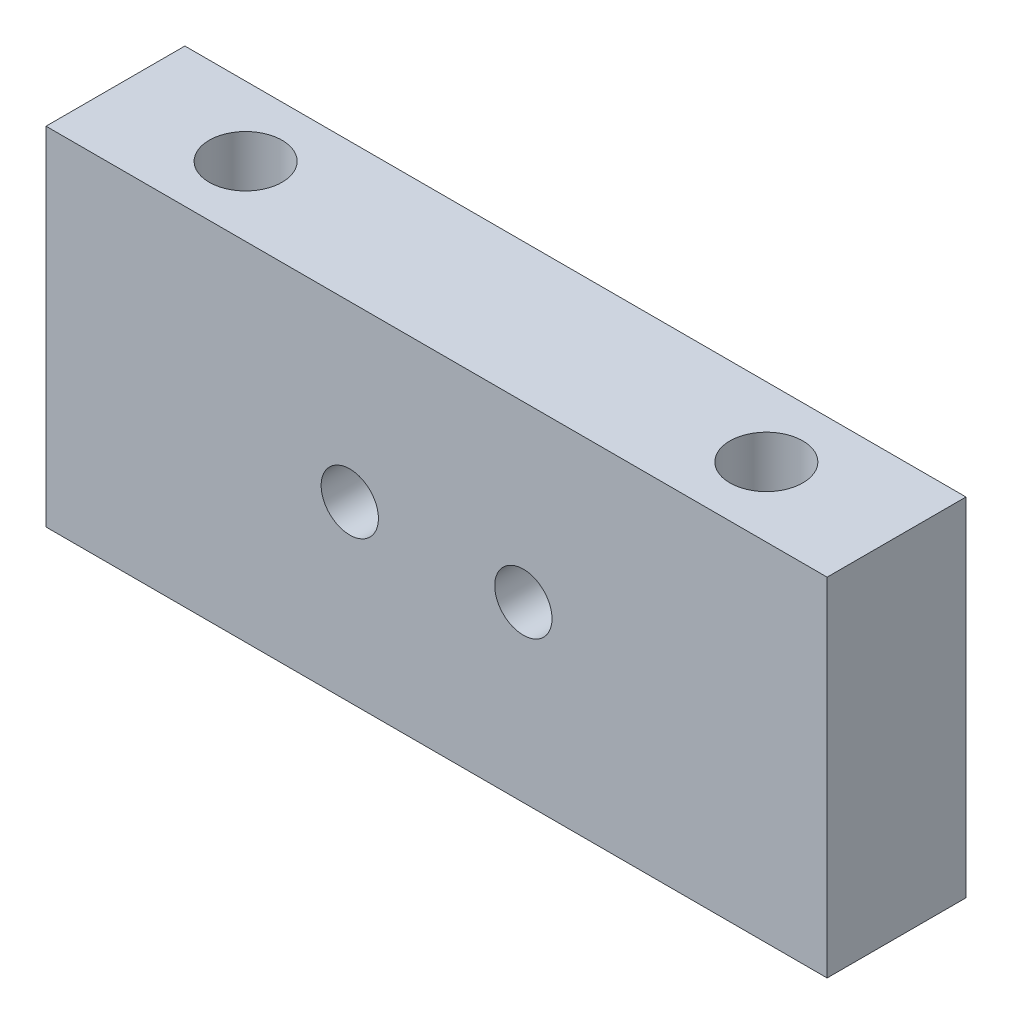
ISO-10303-21;
HEADER;
FILE_DESCRIPTION(('STEP AP214'),'2;1');
FILE_NAME('part.step','',(''),(''),'','','');
FILE_SCHEMA(('AUTOMOTIVE_DESIGN { 1 0 10303 214 1 1 1 1 }'));
ENDSEC;
DATA;
#1=APPLICATION_CONTEXT('core data for automotive mechanical design processes');
#2=APPLICATION_PROTOCOL_DEFINITION('international standard','automotive_design',2000,#1);
#3=PRODUCT_CONTEXT('',#1,'mechanical');
#4=PRODUCT('Part','Part','',(#3));
#5=PRODUCT_RELATED_PRODUCT_CATEGORY('part','',(#4));
#6=PRODUCT_DEFINITION_FORMATION('','',#4);
#7=PRODUCT_DEFINITION_CONTEXT('part definition',#1,'design');
#8=PRODUCT_DEFINITION('design','',#6,#7);
#9=PRODUCT_DEFINITION_SHAPE('','',#8);
#10=(LENGTH_UNIT() NAMED_UNIT(*) SI_UNIT(.MILLI.,.METRE.));
#11=(NAMED_UNIT(*) PLANE_ANGLE_UNIT() SI_UNIT($,.RADIAN.));
#12=(NAMED_UNIT(*) SI_UNIT($,.STERADIAN.) SOLID_ANGLE_UNIT());
#13=UNCERTAINTY_MEASURE_WITH_UNIT(LENGTH_MEASURE(1.E-05),#10,'distance_accuracy_value','');
#14=(GEOMETRIC_REPRESENTATION_CONTEXT(3) GLOBAL_UNCERTAINTY_ASSIGNED_CONTEXT((#13)) GLOBAL_UNIT_ASSIGNED_CONTEXT((#10,
#11,#12)) REPRESENTATION_CONTEXT('',''));
#15=CARTESIAN_POINT('',(0.,0.,0.));
#16=DIRECTION('',(0.,0.,1.));
#17=DIRECTION('',(1.,0.,0.));
#18=AXIS2_PLACEMENT_3D('',#15,#16,#17);
#19=CARTESIAN_POINT('',(0.,0.,8.));
#20=DIRECTION('',(1.,0.,0.));
#21=DIRECTION('',(0.,0.,-1.));
#22=AXIS2_PLACEMENT_3D('',#19,#20,#21);
#23=PLANE('',#22);
#24=DIRECTION('',(0.,-1.,0.));
#25=VECTOR('',#24,1.);
#26=CARTESIAN_POINT('',(0.,0.,0.));
#27=LINE('',#26,#25);
#28=CARTESIAN_POINT('',(0.,20.,0.));
#29=VERTEX_POINT('',#28);
#30=CARTESIAN_POINT('',(0.,0.,0.));
#31=VERTEX_POINT('',#30);
#32=EDGE_CURVE('E122',#29,#31,#27,.T.);
#33=ORIENTED_EDGE('',*,*,#32,.T.);
#34=DIRECTION('',(0.,0.,-1.));
#35=VECTOR('',#34,1.);
#36=CARTESIAN_POINT('',(0.,0.,8.));
#37=LINE('',#36,#35);
#38=CARTESIAN_POINT('',(0.,0.,8.));
#39=VERTEX_POINT('',#38);
#40=EDGE_CURVE('E11',#39,#31,#37,.T.);
#41=ORIENTED_EDGE('',*,*,#40,.F.);
#42=DIRECTION('',(0.,-1.,0.));
#43=VECTOR('',#42,1.);
#44=CARTESIAN_POINT('',(0.,0.,8.));
#45=LINE('',#44,#43);
#46=CARTESIAN_POINT('',(0.,20.,8.));
#47=VERTEX_POINT('',#46);
#48=EDGE_CURVE('E123',#47,#39,#45,.T.);
#49=ORIENTED_EDGE('',*,*,#48,.F.);
#50=DIRECTION('',(0.,0.,-1.));
#51=VECTOR('',#50,1.);
#52=CARTESIAN_POINT('',(0.,20.,8.));
#53=LINE('',#52,#51);
#54=EDGE_CURVE('E129',#47,#29,#53,.T.);
#55=ORIENTED_EDGE('',*,*,#54,.T.);
#56=EDGE_LOOP('',(#33,#41,#49,#55));
#57=FACE_BOUND('',#56,.T.);
#58=ADVANCED_FACE('F17',(#57),#23,.F.);
#59=CARTESIAN_POINT('',(0.,0.,8.));
#60=DIRECTION('',(0.,1.,0.));
#61=DIRECTION('',(0.,0.,1.));
#62=AXIS2_PLACEMENT_3D('',#59,#60,#61);
#63=PLANE('',#62);
#64=DIRECTION('',(1.,0.,0.));
#65=VECTOR('',#64,1.);
#66=CARTESIAN_POINT('',(0.,0.,0.));
#67=LINE('',#66,#65);
#68=CARTESIAN_POINT('',(45.,0.,0.));
#69=VERTEX_POINT('',#68);
#70=EDGE_CURVE('E132',#31,#69,#67,.T.);
#71=ORIENTED_EDGE('',*,*,#70,.T.);
#72=DIRECTION('',(0.,0.,-1.));
#73=VECTOR('',#72,1.);
#74=CARTESIAN_POINT('',(45.,0.,8.));
#75=LINE('',#74,#73);
#76=CARTESIAN_POINT('',(45.,0.,8.));
#77=VERTEX_POINT('',#76);
#78=EDGE_CURVE('E25',#77,#69,#75,.T.);
#79=ORIENTED_EDGE('',*,*,#78,.F.);
#80=DIRECTION('',(1.,0.,0.));
#81=VECTOR('',#80,1.);
#82=CARTESIAN_POINT('',(0.,0.,8.));
#83=LINE('',#82,#81);
#84=EDGE_CURVE('E64',#39,#77,#83,.T.);
#85=ORIENTED_EDGE('',*,*,#84,.F.);
#86=ORIENTED_EDGE('',*,*,#40,.T.);
#87=EDGE_LOOP('',(#71,#79,#85,#86));
#88=FACE_BOUND('',#87,.T.);
#89=ADVANCED_FACE('F159',(#88),#63,.F.);
#90=CARTESIAN_POINT('',(45.,0.,8.));
#91=DIRECTION('',(-1.,0.,0.));
#92=DIRECTION('',(0.,0.,1.));
#93=AXIS2_PLACEMENT_3D('',#90,#91,#92);
#94=PLANE('',#93);
#95=DIRECTION('',(0.,1.,0.));
#96=VECTOR('',#95,1.);
#97=CARTESIAN_POINT('',(45.,0.,0.));
#98=LINE('',#97,#96);
#99=CARTESIAN_POINT('',(45.,20.,0.));
#100=VERTEX_POINT('',#99);
#101=EDGE_CURVE('E51',#69,#100,#98,.T.);
#102=ORIENTED_EDGE('',*,*,#101,.T.);
#103=DIRECTION('',(0.,0.,-1.));
#104=VECTOR('',#103,1.);
#105=CARTESIAN_POINT('',(45.,20.,8.));
#106=LINE('',#105,#104);
#107=CARTESIAN_POINT('',(45.,20.,8.));
#108=VERTEX_POINT('',#107);
#109=EDGE_CURVE('E137',#108,#100,#106,.T.);
#110=ORIENTED_EDGE('',*,*,#109,.F.);
#111=DIRECTION('',(0.,1.,0.));
#112=VECTOR('',#111,1.);
#113=CARTESIAN_POINT('',(45.,0.,8.));
#114=LINE('',#113,#112);
#115=EDGE_CURVE('E126',#77,#108,#114,.T.);
#116=ORIENTED_EDGE('',*,*,#115,.F.);
#117=ORIENTED_EDGE('',*,*,#78,.T.);
#118=EDGE_LOOP('',(#102,#110,#116,#117));
#119=FACE_BOUND('',#118,.T.);
#120=ADVANCED_FACE('F139',(#119),#94,.F.);
#121=CARTESIAN_POINT('',(0.,20.,8.));
#122=DIRECTION('',(0.,-1.,0.));
#123=DIRECTION('',(0.,0.,-1.));
#124=AXIS2_PLACEMENT_3D('',#121,#122,#123);
#125=PLANE('',#124);
#126=CARTESIAN_POINT('',(7.5,20.,4.));
#127=DIRECTION('',(0.,1.,0.));
#128=DIRECTION('',(0.,0.,1.));
#129=AXIS2_PLACEMENT_3D('',#126,#127,#128);
#130=CIRCLE('',#129,2.1);
#131=CARTESIAN_POINT('',(7.5,20.,6.1));
#132=VERTEX_POINT('',#131);
#133=EDGE_CURVE('E110',#132,#132,#130,.T.);
#134=ORIENTED_EDGE('',*,*,#133,.F.);
#135=EDGE_LOOP('',(#134));
#136=FACE_BOUND('',#135,.T.);
#137=CARTESIAN_POINT('',(37.5,20.,4.));
#138=DIRECTION('',(0.,1.,0.));
#139=DIRECTION('',(0.,0.,1.));
#140=AXIS2_PLACEMENT_3D('',#137,#138,#139);
#141=CIRCLE('',#140,2.1);
#142=CARTESIAN_POINT('',(37.5,20.,6.1));
#143=VERTEX_POINT('',#142);
#144=EDGE_CURVE('E116',#143,#143,#141,.T.);
#145=ORIENTED_EDGE('',*,*,#144,.F.);
#146=EDGE_LOOP('',(#145));
#147=FACE_BOUND('',#146,.T.);
#148=DIRECTION('',(-1.,0.,0.));
#149=VECTOR('',#148,1.);
#150=CARTESIAN_POINT('',(0.,20.,0.));
#151=LINE('',#150,#149);
#152=EDGE_CURVE('E57',#100,#29,#151,.T.);
#153=ORIENTED_EDGE('',*,*,#152,.T.);
#154=ORIENTED_EDGE('',*,*,#54,.F.);
#155=DIRECTION('',(-1.,0.,0.));
#156=VECTOR('',#155,1.);
#157=CARTESIAN_POINT('',(0.,20.,8.));
#158=LINE('',#157,#156);
#159=EDGE_CURVE('E33',#108,#47,#158,.T.);
#160=ORIENTED_EDGE('',*,*,#159,.F.);
#161=ORIENTED_EDGE('',*,*,#109,.T.);
#162=EDGE_LOOP('',(#153,#154,#160,#161));
#163=FACE_BOUND('',#162,.T.);
#164=ADVANCED_FACE('F146',(#136,#147,#163),#125,.F.);
#165=CARTESIAN_POINT('',(0.,0.,8.));
#166=DIRECTION('',(0.,0.,-1.));
#167=DIRECTION('',(-1.,0.,0.));
#168=AXIS2_PLACEMENT_3D('',#165,#166,#167);
#169=PLANE('',#168);
#170=CARTESIAN_POINT('',(17.5,10.,8.));
#171=DIRECTION('',(0.,0.,1.));
#172=DIRECTION('',(1.,0.,0.));
#173=AXIS2_PLACEMENT_3D('',#170,#171,#172);
#174=CIRCLE('',#173,1.65);
#175=CARTESIAN_POINT('',(19.15,10.,8.));
#176=VERTEX_POINT('',#175);
#177=EDGE_CURVE('E98',#176,#176,#174,.T.);
#178=ORIENTED_EDGE('',*,*,#177,.F.);
#179=EDGE_LOOP('',(#178));
#180=FACE_BOUND('',#179,.T.);
#181=CARTESIAN_POINT('',(27.5,10.,8.));
#182=DIRECTION('',(0.,0.,1.));
#183=DIRECTION('',(1.,0.,0.));
#184=AXIS2_PLACEMENT_3D('',#181,#182,#183);
#185=CIRCLE('',#184,1.65);
#186=CARTESIAN_POINT('',(29.15,10.,8.));
#187=VERTEX_POINT('',#186);
#188=EDGE_CURVE('E104',#187,#187,#185,.T.);
#189=ORIENTED_EDGE('',*,*,#188,.F.);
#190=EDGE_LOOP('',(#189));
#191=FACE_BOUND('',#190,.T.);
#192=ORIENTED_EDGE('',*,*,#48,.T.);
#193=ORIENTED_EDGE('',*,*,#84,.T.);
#194=ORIENTED_EDGE('',*,*,#115,.T.);
#195=ORIENTED_EDGE('',*,*,#159,.T.);
#196=EDGE_LOOP('',(#192,#193,#194,#195));
#197=FACE_BOUND('',#196,.T.);
#198=ADVANCED_FACE('F148',(#180,#191,#197),#169,.F.);
#199=CARTESIAN_POINT('',(0.,0.,0.));
#200=DIRECTION('',(0.,0.,-1.));
#201=DIRECTION('',(-1.,0.,0.));
#202=AXIS2_PLACEMENT_3D('',#199,#200,#201);
#203=PLANE('',#202);
#204=CARTESIAN_POINT('',(22.5,5.,0.));
#205=DIRECTION('',(0.,0.,-1.));
#206=DIRECTION('',(-1.,0.,0.));
#207=AXIS2_PLACEMENT_3D('',#204,#205,#206);
#208=CIRCLE('',#207,1.49999999999999);
#209=CARTESIAN_POINT('',(21.,5.,0.));
#210=VERTEX_POINT('',#209);
#211=EDGE_CURVE('E88',#210,#210,#208,.T.);
#212=ORIENTED_EDGE('',*,*,#211,.F.);
#213=EDGE_LOOP('',(#212));
#214=FACE_BOUND('',#213,.T.);
#215=CARTESIAN_POINT('',(22.5,15.,0.));
#216=DIRECTION('',(0.,0.,-1.));
#217=DIRECTION('',(-1.,0.,0.));
#218=AXIS2_PLACEMENT_3D('',#215,#216,#217);
#219=CIRCLE('',#218,1.49999999999999);
#220=CARTESIAN_POINT('',(21.,15.,0.));
#221=VERTEX_POINT('',#220);
#222=EDGE_CURVE('E87',#221,#221,#219,.T.);
#223=ORIENTED_EDGE('',*,*,#222,.F.);
#224=EDGE_LOOP('',(#223));
#225=FACE_BOUND('',#224,.T.);
#226=CARTESIAN_POINT('',(17.5,10.,0.));
#227=DIRECTION('',(0.,0.,1.));
#228=DIRECTION('',(1.,0.,0.));
#229=AXIS2_PLACEMENT_3D('',#226,#227,#228);
#230=CIRCLE('',#229,1.65);
#231=CARTESIAN_POINT('',(19.15,10.,0.));
#232=VERTEX_POINT('',#231);
#233=EDGE_CURVE('E101',#232,#232,#230,.T.);
#234=ORIENTED_EDGE('',*,*,#233,.T.);
#235=EDGE_LOOP('',(#234));
#236=FACE_BOUND('',#235,.T.);
#237=CARTESIAN_POINT('',(27.5,10.,0.));
#238=DIRECTION('',(0.,0.,1.));
#239=DIRECTION('',(1.,0.,0.));
#240=AXIS2_PLACEMENT_3D('',#237,#238,#239);
#241=CIRCLE('',#240,1.65);
#242=CARTESIAN_POINT('',(29.15,10.,0.));
#243=VERTEX_POINT('',#242);
#244=EDGE_CURVE('E107',#243,#243,#241,.T.);
#245=ORIENTED_EDGE('',*,*,#244,.T.);
#246=EDGE_LOOP('',(#245));
#247=FACE_BOUND('',#246,.T.);
#248=ORIENTED_EDGE('',*,*,#32,.F.);
#249=ORIENTED_EDGE('',*,*,#152,.F.);
#250=ORIENTED_EDGE('',*,*,#101,.F.);
#251=ORIENTED_EDGE('',*,*,#70,.F.);
#252=EDGE_LOOP('',(#248,#249,#250,#251));
#253=FACE_BOUND('',#252,.T.);
#254=ADVANCED_FACE('F142',(#214,#225,#236,#247,#253),#203,.T.);
#255=CARTESIAN_POINT('',(37.5,7.6,4.));
#256=DIRECTION('',(0.,1.,0.));
#257=DIRECTION('',(0.,0.,1.));
#258=AXIS2_PLACEMENT_3D('',#255,#256,#257);
#259=CONICAL_SURFACE('',#258,2.1,1.02974425867666);
#260=CARTESIAN_POINT('',(37.5,6.33819270004214,4.));
#261=VERTEX_POINT('',#260);
#262=VERTEX_LOOP('',#261);
#263=FACE_BOUND('',#262,.T.);
#264=CARTESIAN_POINT('',(37.5,7.6,4.));
#265=DIRECTION('',(0.,1.,0.));
#266=DIRECTION('',(0.,0.,1.));
#267=AXIS2_PLACEMENT_3D('',#264,#265,#266);
#268=CIRCLE('',#267,2.1);
#269=CARTESIAN_POINT('',(37.5,7.6,6.1));
#270=VERTEX_POINT('',#269);
#271=EDGE_CURVE('E119',#270,#270,#268,.T.);
#272=ORIENTED_EDGE('',*,*,#271,.T.);
#273=EDGE_LOOP('',(#272));
#274=FACE_BOUND('',#273,.T.);
#275=ADVANCED_FACE('F292',(#263,#274),#259,.F.);
#276=CARTESIAN_POINT('',(37.5,20.,4.));
#277=DIRECTION('',(0.,1.,0.));
#278=DIRECTION('',(0.,0.,1.));
#279=AXIS2_PLACEMENT_3D('',#276,#277,#278);
#280=CYLINDRICAL_SURFACE('',#279,2.1);
#281=ORIENTED_EDGE('',*,*,#271,.F.);
#282=EDGE_LOOP('',(#281));
#283=FACE_BOUND('',#282,.T.);
#284=ORIENTED_EDGE('',*,*,#144,.T.);
#285=EDGE_LOOP('',(#284));
#286=FACE_BOUND('',#285,.T.);
#287=ADVANCED_FACE('F280',(#283,#286),#280,.F.);
#288=CARTESIAN_POINT('',(7.5,7.6,4.));
#289=DIRECTION('',(0.,1.,0.));
#290=DIRECTION('',(0.,0.,1.));
#291=AXIS2_PLACEMENT_3D('',#288,#289,#290);
#292=CONICAL_SURFACE('',#291,2.1,1.02974425867665);
#293=CARTESIAN_POINT('',(7.5,6.33819270004214,4.));
#294=VERTEX_POINT('',#293);
#295=VERTEX_LOOP('',#294);
#296=FACE_BOUND('',#295,.T.);
#297=CARTESIAN_POINT('',(7.5,7.6,4.));
#298=DIRECTION('',(0.,1.,0.));
#299=DIRECTION('',(0.,0.,1.));
#300=AXIS2_PLACEMENT_3D('',#297,#298,#299);
#301=CIRCLE('',#300,2.1);
#302=CARTESIAN_POINT('',(7.5,7.6,6.1));
#303=VERTEX_POINT('',#302);
#304=EDGE_CURVE('E113',#303,#303,#301,.T.);
#305=ORIENTED_EDGE('',*,*,#304,.T.);
#306=EDGE_LOOP('',(#305));
#307=FACE_BOUND('',#306,.T.);
#308=ADVANCED_FACE('F267',(#296,#307),#292,.F.);
#309=CARTESIAN_POINT('',(7.5,20.,4.));
#310=DIRECTION('',(0.,1.,0.));
#311=DIRECTION('',(0.,0.,1.));
#312=AXIS2_PLACEMENT_3D('',#309,#310,#311);
#313=CYLINDRICAL_SURFACE('',#312,2.1);
#314=ORIENTED_EDGE('',*,*,#304,.F.);
#315=EDGE_LOOP('',(#314));
#316=FACE_BOUND('',#315,.T.);
#317=ORIENTED_EDGE('',*,*,#133,.T.);
#318=EDGE_LOOP('',(#317));
#319=FACE_BOUND('',#318,.T.);
#320=ADVANCED_FACE('F255',(#316,#319),#313,.F.);
#321=CARTESIAN_POINT('',(27.5,10.,8.));
#322=DIRECTION('',(0.,0.,1.));
#323=DIRECTION('',(1.,0.,0.));
#324=AXIS2_PLACEMENT_3D('',#321,#322,#323);
#325=CYLINDRICAL_SURFACE('',#324,1.65);
#326=ORIENTED_EDGE('',*,*,#244,.F.);
#327=EDGE_LOOP('',(#326));
#328=FACE_BOUND('',#327,.T.);
#329=ORIENTED_EDGE('',*,*,#188,.T.);
#330=EDGE_LOOP('',(#329));
#331=FACE_BOUND('',#330,.T.);
#332=ADVANCED_FACE('F243',(#328,#331),#325,.F.);
#333=CARTESIAN_POINT('',(17.5,10.,8.));
#334=DIRECTION('',(0.,0.,1.));
#335=DIRECTION('',(1.,0.,0.));
#336=AXIS2_PLACEMENT_3D('',#333,#334,#335);
#337=CYLINDRICAL_SURFACE('',#336,1.65);
#338=ORIENTED_EDGE('',*,*,#233,.F.);
#339=EDGE_LOOP('',(#338));
#340=FACE_BOUND('',#339,.T.);
#341=ORIENTED_EDGE('',*,*,#177,.T.);
#342=EDGE_LOOP('',(#341));
#343=FACE_BOUND('',#342,.T.);
#344=ADVANCED_FACE('F232',(#340,#343),#337,.F.);
#345=CARTESIAN_POINT('',(22.5,15.,5.));
#346=DIRECTION('',(0.,0.,-1.));
#347=DIRECTION('',(-1.,0.,0.));
#348=AXIS2_PLACEMENT_3D('',#345,#346,#347);
#349=CONICAL_SURFACE('',#348,1.5,1.02974425867665);
#350=CARTESIAN_POINT('',(22.5,15.,5.90129092854134));
#351=VERTEX_POINT('',#350);
#352=VERTEX_LOOP('',#351);
#353=FACE_BOUND('',#352,.T.);
#354=CARTESIAN_POINT('',(22.5,15.,5.));
#355=DIRECTION('',(0.,0.,-1.));
#356=DIRECTION('',(-1.,0.,0.));
#357=AXIS2_PLACEMENT_3D('',#354,#355,#356);
#358=CIRCLE('',#357,1.5);
#359=CARTESIAN_POINT('',(21.,15.,5.));
#360=VERTEX_POINT('',#359);
#361=EDGE_CURVE('E91',#360,#360,#358,.T.);
#362=ORIENTED_EDGE('',*,*,#361,.T.);
#363=EDGE_LOOP('',(#362));
#364=FACE_BOUND('',#363,.T.);
#365=ADVANCED_FACE('F225',(#353,#364),#349,.F.);
#366=CARTESIAN_POINT('',(22.5,15.,0.));
#367=DIRECTION('',(0.,0.,-1.));
#368=DIRECTION('',(-1.,0.,0.));
#369=AXIS2_PLACEMENT_3D('',#366,#367,#368);
#370=CYLINDRICAL_SURFACE('',#369,1.5);
#371=ORIENTED_EDGE('',*,*,#361,.F.);
#372=EDGE_LOOP('',(#371));
#373=FACE_BOUND('',#372,.T.);
#374=ORIENTED_EDGE('',*,*,#222,.T.);
#375=EDGE_LOOP('',(#374));
#376=FACE_BOUND('',#375,.T.);
#377=ADVANCED_FACE('F81',(#373,#376),#370,.F.);
#378=CARTESIAN_POINT('',(22.5,5.,5.));
#379=DIRECTION('',(0.,0.,-1.));
#380=DIRECTION('',(-1.,0.,0.));
#381=AXIS2_PLACEMENT_3D('',#378,#379,#380);
#382=CONICAL_SURFACE('',#381,1.5,1.02974425867665);
#383=CARTESIAN_POINT('',(22.5,5.,5.90129092854134));
#384=VERTEX_POINT('',#383);
#385=VERTEX_LOOP('',#384);
#386=FACE_BOUND('',#385,.T.);
#387=CARTESIAN_POINT('',(22.5,5.,5.));
#388=DIRECTION('',(0.,0.,-1.));
#389=DIRECTION('',(-1.,0.,0.));
#390=AXIS2_PLACEMENT_3D('',#387,#388,#389);
#391=CIRCLE('',#390,1.5);
#392=CARTESIAN_POINT('',(21.,5.,5.));
#393=VERTEX_POINT('',#392);
#394=EDGE_CURVE('E85',#393,#393,#391,.T.);
#395=ORIENTED_EDGE('',*,*,#394,.T.);
#396=EDGE_LOOP('',(#395));
#397=FACE_BOUND('',#396,.T.);
#398=ADVANCED_FACE('F77',(#386,#397),#382,.F.);
#399=CARTESIAN_POINT('',(22.5,5.,0.));
#400=DIRECTION('',(0.,0.,-1.));
#401=DIRECTION('',(-1.,0.,0.));
#402=AXIS2_PLACEMENT_3D('',#399,#400,#401);
#403=CYLINDRICAL_SURFACE('',#402,1.5);
#404=ORIENTED_EDGE('',*,*,#394,.F.);
#405=EDGE_LOOP('',(#404));
#406=FACE_BOUND('',#405,.T.);
#407=ORIENTED_EDGE('',*,*,#211,.T.);
#408=EDGE_LOOP('',(#407));
#409=FACE_BOUND('',#408,.T.);
#410=ADVANCED_FACE('F80',(#406,#409),#403,.F.);
#411=CLOSED_SHELL('',(#58,#89,#120,#164,#198,#254,#275,#287,#308,#320,#332,#344,#365,#377,#398,#410));
#412=MANIFOLD_SOLID_BREP('B1',#411);
#413=ADVANCED_BREP_SHAPE_REPRESENTATION('',(#18,#412),#14);
#414=SHAPE_DEFINITION_REPRESENTATION(#9,#413);
ENDSEC;
END-ISO-10303-21;
